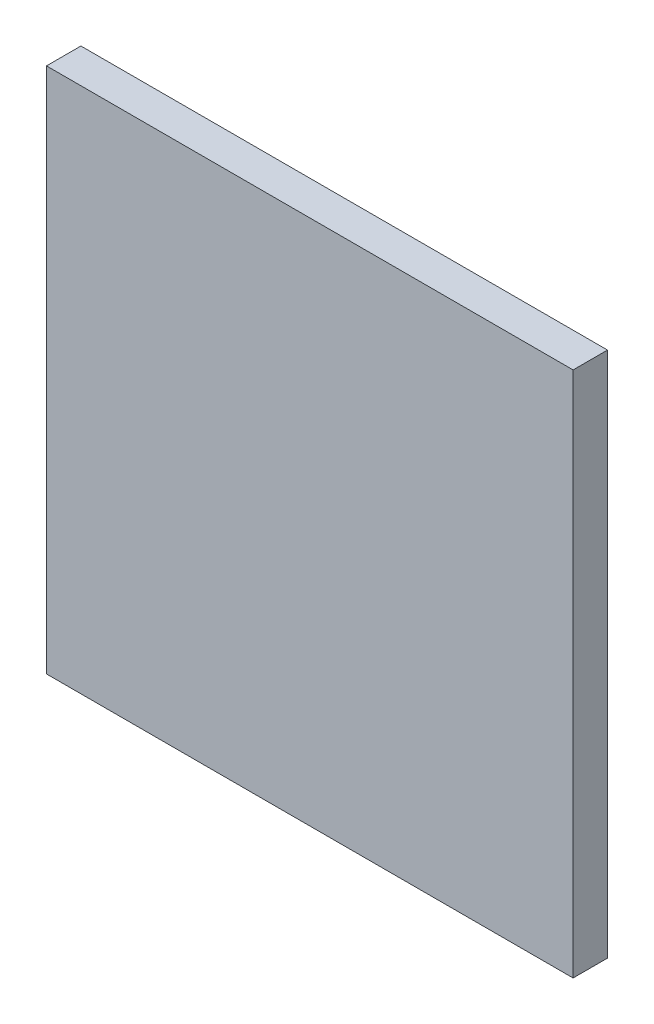
ISO-10303-21;
HEADER;
FILE_DESCRIPTION(('STEP AP214'),'2;1');
FILE_NAME('part.step','',(''),(''),'','','');
FILE_SCHEMA(('AUTOMOTIVE_DESIGN { 1 0 10303 214 1 1 1 1 }'));
ENDSEC;
DATA;
#1=APPLICATION_CONTEXT('core data for automotive mechanical design processes');
#2=APPLICATION_PROTOCOL_DEFINITION('international standard','automotive_design',2000,#1);
#3=PRODUCT_CONTEXT('',#1,'mechanical');
#4=PRODUCT('Part','Part','',(#3));
#5=PRODUCT_RELATED_PRODUCT_CATEGORY('part','',(#4));
#6=PRODUCT_DEFINITION_FORMATION('','',#4);
#7=PRODUCT_DEFINITION_CONTEXT('part definition',#1,'design');
#8=PRODUCT_DEFINITION('design','',#6,#7);
#9=PRODUCT_DEFINITION_SHAPE('','',#8);
#10=(LENGTH_UNIT() NAMED_UNIT(*) SI_UNIT(.MILLI.,.METRE.));
#11=(NAMED_UNIT(*) PLANE_ANGLE_UNIT() SI_UNIT($,.RADIAN.));
#12=(NAMED_UNIT(*) SI_UNIT($,.STERADIAN.) SOLID_ANGLE_UNIT());
#13=UNCERTAINTY_MEASURE_WITH_UNIT(LENGTH_MEASURE(1.E-05),#10,'distance_accuracy_value','');
#14=(GEOMETRIC_REPRESENTATION_CONTEXT(3) GLOBAL_UNCERTAINTY_ASSIGNED_CONTEXT((#13)) GLOBAL_UNIT_ASSIGNED_CONTEXT((#10,
#11,#12)) REPRESENTATION_CONTEXT('',''));
#15=CARTESIAN_POINT('',(0.,0.,0.));
#16=DIRECTION('',(0.,0.,1.));
#17=DIRECTION('',(1.,0.,0.));
#18=AXIS2_PLACEMENT_3D('',#15,#16,#17);
#19=CARTESIAN_POINT('',(-33.0039370078741,34.992125984252,6.6));
#20=DIRECTION('',(1.,0.,0.));
#21=DIRECTION('',(0.,1.,0.));
#22=AXIS2_PLACEMENT_3D('',#19,#20,#21);
#23=PLANE('',#22);
#24=DIRECTION('',(0.,-1.,0.));
#25=VECTOR('',#24,1.);
#26=CARTESIAN_POINT('',(-33.0039370078741,34.992125984252,0.));
#27=LINE('',#26,#25);
#28=CARTESIAN_POINT('',(-33.0039370078741,34.992125984252,0.));
#29=VERTEX_POINT('',#28);
#30=CARTESIAN_POINT('',(-33.003937007874,-66.007874015748,0.));
#31=VERTEX_POINT('',#30);
#32=EDGE_CURVE('E107',#29,#31,#27,.T.);
#33=ORIENTED_EDGE('',*,*,#32,.T.);
#34=DIRECTION('',(0.,0.,-1.));
#35=VECTOR('',#34,1.);
#36=CARTESIAN_POINT('',(-33.003937007874,-66.007874015748,6.6));
#37=LINE('',#36,#35);
#38=CARTESIAN_POINT('',(-33.003937007874,-66.007874015748,6.6));
#39=VERTEX_POINT('',#38);
#40=EDGE_CURVE('E11',#39,#31,#37,.T.);
#41=ORIENTED_EDGE('',*,*,#40,.F.);
#42=DIRECTION('',(0.,-1.,0.));
#43=VECTOR('',#42,1.);
#44=CARTESIAN_POINT('',(-33.0039370078741,34.992125984252,6.6));
#45=LINE('',#44,#43);
#46=CARTESIAN_POINT('',(-33.0039370078741,34.992125984252,6.6));
#47=VERTEX_POINT('',#46);
#48=EDGE_CURVE('E91',#47,#39,#45,.T.);
#49=ORIENTED_EDGE('',*,*,#48,.F.);
#50=DIRECTION('',(0.,0.,-1.));
#51=VECTOR('',#50,1.);
#52=CARTESIAN_POINT('',(-33.0039370078741,34.992125984252,6.6));
#53=LINE('',#52,#51);
#54=EDGE_CURVE('E103',#47,#29,#53,.T.);
#55=ORIENTED_EDGE('',*,*,#54,.T.);
#56=EDGE_LOOP('',(#33,#41,#49,#55));
#57=FACE_BOUND('',#56,.T.);
#58=ADVANCED_FACE('F39',(#57),#23,.F.);
#59=CARTESIAN_POINT('',(-33.003937007874,-66.007874015748,6.6));
#60=DIRECTION('',(0.,1.,0.));
#61=DIRECTION('',(0.,0.,1.));
#62=AXIS2_PLACEMENT_3D('',#59,#60,#61);
#63=PLANE('',#62);
#64=DIRECTION('',(1.,0.,0.));
#65=VECTOR('',#64,1.);
#66=CARTESIAN_POINT('',(-33.003937007874,-66.007874015748,0.));
#67=LINE('',#66,#65);
#68=CARTESIAN_POINT('',(67.996062992126,-66.007874015748,0.));
#69=VERTEX_POINT('',#68);
#70=EDGE_CURVE('E96',#31,#69,#67,.T.);
#71=ORIENTED_EDGE('',*,*,#70,.T.);
#72=DIRECTION('',(0.,0.,-1.));
#73=VECTOR('',#72,1.);
#74=CARTESIAN_POINT('',(67.996062992126,-66.007874015748,6.6));
#75=LINE('',#74,#73);
#76=CARTESIAN_POINT('',(67.996062992126,-66.007874015748,6.6));
#77=VERTEX_POINT('',#76);
#78=EDGE_CURVE('E48',#77,#69,#75,.T.);
#79=ORIENTED_EDGE('',*,*,#78,.F.);
#80=DIRECTION('',(1.,0.,0.));
#81=VECTOR('',#80,1.);
#82=CARTESIAN_POINT('',(-33.003937007874,-66.007874015748,6.6));
#83=LINE('',#82,#81);
#84=EDGE_CURVE('E86',#39,#77,#83,.T.);
#85=ORIENTED_EDGE('',*,*,#84,.F.);
#86=ORIENTED_EDGE('',*,*,#40,.T.);
#87=EDGE_LOOP('',(#71,#79,#85,#86));
#88=FACE_BOUND('',#87,.T.);
#89=ADVANCED_FACE('F95',(#88),#63,.F.);
#90=CARTESIAN_POINT('',(67.996062992126,34.992125984252,6.6));
#91=DIRECTION('',(-1.,0.,0.));
#92=DIRECTION('',(0.,-1.,0.));
#93=AXIS2_PLACEMENT_3D('',#90,#91,#92);
#94=PLANE('',#93);
#95=DIRECTION('',(0.,1.,0.));
#96=VECTOR('',#95,1.);
#97=CARTESIAN_POINT('',(67.996062992126,34.992125984252,0.));
#98=LINE('',#97,#96);
#99=CARTESIAN_POINT('',(67.996062992126,34.992125984252,0.));
#100=VERTEX_POINT('',#99);
#101=EDGE_CURVE('E73',#69,#100,#98,.T.);
#102=ORIENTED_EDGE('',*,*,#101,.T.);
#103=DIRECTION('',(0.,0.,-1.));
#104=VECTOR('',#103,1.);
#105=CARTESIAN_POINT('',(67.996062992126,34.992125984252,6.6));
#106=LINE('',#105,#104);
#107=CARTESIAN_POINT('',(67.996062992126,34.992125984252,6.6));
#108=VERTEX_POINT('',#107);
#109=EDGE_CURVE('E98',#108,#100,#106,.T.);
#110=ORIENTED_EDGE('',*,*,#109,.F.);
#111=DIRECTION('',(0.,1.,0.));
#112=VECTOR('',#111,1.);
#113=CARTESIAN_POINT('',(67.996062992126,34.992125984252,6.6));
#114=LINE('',#113,#112);
#115=EDGE_CURVE('E89',#77,#108,#114,.T.);
#116=ORIENTED_EDGE('',*,*,#115,.F.);
#117=ORIENTED_EDGE('',*,*,#78,.T.);
#118=EDGE_LOOP('',(#102,#110,#116,#117));
#119=FACE_BOUND('',#118,.T.);
#120=ADVANCED_FACE('F99',(#119),#94,.F.);
#121=CARTESIAN_POINT('',(-33.0039370078741,34.992125984252,6.6));
#122=DIRECTION('',(0.,-1.,0.));
#123=DIRECTION('',(1.,0.,0.));
#124=AXIS2_PLACEMENT_3D('',#121,#122,#123);
#125=PLANE('',#124);
#126=DIRECTION('',(-1.,0.,0.));
#127=VECTOR('',#126,1.);
#128=CARTESIAN_POINT('',(-33.0039370078741,34.992125984252,0.));
#129=LINE('',#128,#127);
#130=EDGE_CURVE('E79',#100,#29,#129,.T.);
#131=ORIENTED_EDGE('',*,*,#130,.T.);
#132=ORIENTED_EDGE('',*,*,#54,.F.);
#133=DIRECTION('',(-1.,0.,0.));
#134=VECTOR('',#133,1.);
#135=CARTESIAN_POINT('',(-33.0039370078741,34.992125984252,6.6));
#136=LINE('',#135,#134);
#137=EDGE_CURVE('E56',#108,#47,#136,.T.);
#138=ORIENTED_EDGE('',*,*,#137,.F.);
#139=ORIENTED_EDGE('',*,*,#109,.T.);
#140=EDGE_LOOP('',(#131,#132,#138,#139));
#141=FACE_BOUND('',#140,.T.);
#142=ADVANCED_FACE('F120',(#141),#125,.F.);
#143=CARTESIAN_POINT('',(0.,0.,6.6));
#144=DIRECTION('',(0.,0.,1.));
#145=DIRECTION('',(1.,0.,0.));
#146=AXIS2_PLACEMENT_3D('',#143,#144,#145);
#147=PLANE('',#146);
#148=ORIENTED_EDGE('',*,*,#48,.T.);
#149=ORIENTED_EDGE('',*,*,#84,.T.);
#150=ORIENTED_EDGE('',*,*,#115,.T.);
#151=ORIENTED_EDGE('',*,*,#137,.T.);
#152=EDGE_LOOP('',(#148,#149,#150,#151));
#153=FACE_BOUND('',#152,.T.);
#154=ADVANCED_FACE('F87',(#153),#147,.T.);
#155=CARTESIAN_POINT('',(0.,0.,0.));
#156=DIRECTION('',(0.,0.,1.));
#157=DIRECTION('',(1.,0.,0.));
#158=AXIS2_PLACEMENT_3D('',#155,#156,#157);
#159=PLANE('',#158);
#160=ORIENTED_EDGE('',*,*,#32,.F.);
#161=ORIENTED_EDGE('',*,*,#130,.F.);
#162=ORIENTED_EDGE('',*,*,#101,.F.);
#163=ORIENTED_EDGE('',*,*,#70,.F.);
#164=EDGE_LOOP('',(#160,#161,#162,#163));
#165=FACE_BOUND('',#164,.T.);
#166=ADVANCED_FACE('F123',(#165),#159,.F.);
#167=CLOSED_SHELL('',(#58,#89,#120,#142,#154,#166));
#168=MANIFOLD_SOLID_BREP('B2',#167);
#169=ADVANCED_BREP_SHAPE_REPRESENTATION('',(#18,#168),#14);
#170=SHAPE_DEFINITION_REPRESENTATION(#9,#169);
ENDSEC;
END-ISO-10303-21;
